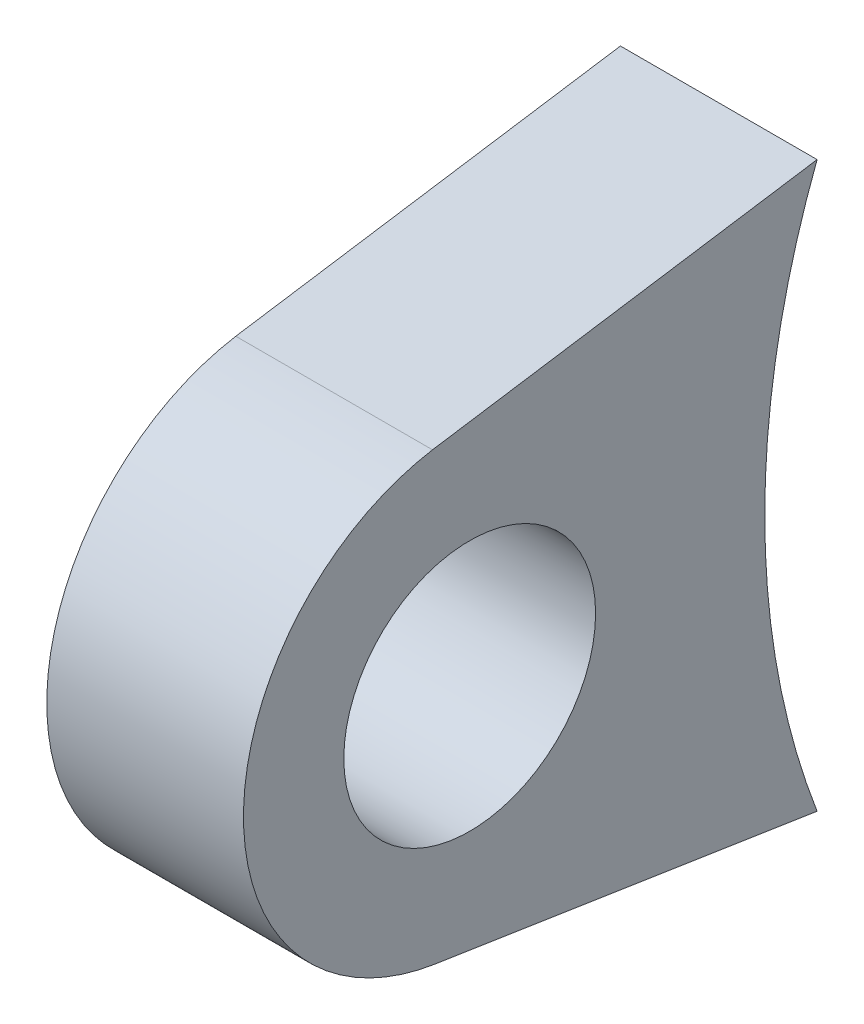
ISO-10303-21;
HEADER;
FILE_DESCRIPTION(('STEP AP214'),'2;1');
FILE_NAME('part.step','',(''),(''),'','','');
FILE_SCHEMA(('AUTOMOTIVE_DESIGN { 1 0 10303 214 1 1 1 1 }'));
ENDSEC;
DATA;
#1=APPLICATION_CONTEXT('core data for automotive mechanical design processes');
#2=APPLICATION_PROTOCOL_DEFINITION('international standard','automotive_design',2000,#1);
#3=PRODUCT_CONTEXT('',#1,'mechanical');
#4=PRODUCT('Part','Part','',(#3));
#5=PRODUCT_RELATED_PRODUCT_CATEGORY('part','',(#4));
#6=PRODUCT_DEFINITION_FORMATION('','',#4);
#7=PRODUCT_DEFINITION_CONTEXT('part definition',#1,'design');
#8=PRODUCT_DEFINITION('design','',#6,#7);
#9=PRODUCT_DEFINITION_SHAPE('','',#8);
#10=(LENGTH_UNIT() NAMED_UNIT(*) SI_UNIT(.MILLI.,.METRE.));
#11=(NAMED_UNIT(*) PLANE_ANGLE_UNIT() SI_UNIT($,.RADIAN.));
#12=(NAMED_UNIT(*) SI_UNIT($,.STERADIAN.) SOLID_ANGLE_UNIT());
#13=UNCERTAINTY_MEASURE_WITH_UNIT(LENGTH_MEASURE(1.E-05),#10,'distance_accuracy_value','');
#14=(GEOMETRIC_REPRESENTATION_CONTEXT(3) GLOBAL_UNCERTAINTY_ASSIGNED_CONTEXT((#13)) GLOBAL_UNIT_ASSIGNED_CONTEXT((#10,
#11,#12)) REPRESENTATION_CONTEXT('',''));
#15=CARTESIAN_POINT('',(0.,0.,0.));
#16=DIRECTION('',(0.,0.,1.));
#17=DIRECTION('',(1.,0.,0.));
#18=AXIS2_PLACEMENT_3D('',#15,#16,#17);
#19=CARTESIAN_POINT('',(86.7854475036722,9.80766511746572,1.50572599900162));
#20=DIRECTION('',(0.,-0.988419292284904,-0.15174749631875));
#21=DIRECTION('',(0.,0.15174749631875,-0.988419292284904));
#22=AXIS2_PLACEMENT_3D('',#19,#20,#21);
#23=PLANE('',#22);
#24=DIRECTION('',(0.,0.15174749631875,-0.988419292284904));
#25=VECTOR('',#24,1.);
#26=CARTESIAN_POINT('',(91.7854475036721,9.80766511746572,1.50572599900162));
#27=LINE('',#26,#25);
#28=CARTESIAN_POINT('',(91.7854475036721,5.67165495404934,28.4459545878146));
#29=VERTEX_POINT('',#28);
#30=CARTESIAN_POINT('',(91.7854475036721,7.17257303718955,18.6696062097244));
#31=VERTEX_POINT('',#30);
#32=EDGE_CURVE('E107',#29,#31,#27,.T.);
#33=ORIENTED_EDGE('',*,*,#32,.T.);
#34=DIRECTION('',(1.,0.,0.));
#35=VECTOR('',#34,1.);
#36=CARTESIAN_POINT('',(86.7854475036722,7.17257303718955,18.6696062097244));
#37=LINE('',#36,#35);
#38=CARTESIAN_POINT('',(86.7854475036722,7.17257303718955,18.6696062097244));
#39=VERTEX_POINT('',#38);
#40=EDGE_CURVE('E11',#39,#31,#37,.T.);
#41=ORIENTED_EDGE('',*,*,#40,.F.);
#42=DIRECTION('',(0.,0.15174749631875,-0.988419292284904));
#43=VECTOR('',#42,1.);
#44=CARTESIAN_POINT('',(86.7854475036722,9.80766511746572,1.50572599900162));
#45=LINE('',#44,#43);
#46=CARTESIAN_POINT('',(86.7854475036722,5.67165495404934,28.4459545878146));
#47=VERTEX_POINT('',#46);
#48=EDGE_CURVE('E98',#47,#39,#45,.T.);
#49=ORIENTED_EDGE('',*,*,#48,.F.);
#50=DIRECTION('',(1.,0.,0.));
#51=VECTOR('',#50,1.);
#52=CARTESIAN_POINT('',(86.7854475036722,5.67165495404934,28.4459545878146));
#53=LINE('',#52,#51);
#54=EDGE_CURVE('E41',#47,#29,#53,.T.);
#55=ORIENTED_EDGE('',*,*,#54,.T.);
#56=EDGE_LOOP('',(#33,#41,#49,#55));
#57=FACE_BOUND('',#56,.T.);
#58=ADVANCED_FACE('F38',(#57),#23,.F.);
#59=CARTESIAN_POINT('',(86.7854475036722,0.,0.));
#60=DIRECTION('',(1.,0.,0.));
#61=DIRECTION('',(0.,0.,-1.));
#62=AXIS2_PLACEMENT_3D('',#59,#60,#61);
#63=CYLINDRICAL_SURFACE('',#62,20.);
#64=CARTESIAN_POINT('',(91.7854475036721,0.,0.));
#65=DIRECTION('',(1.,0.,0.));
#66=DIRECTION('',(0.,0.,-1.));
#67=AXIS2_PLACEMENT_3D('',#64,#65,#66);
#68=CIRCLE('',#67,20.);
#69=CARTESIAN_POINT('',(91.7854475036721,-7.17257303718955,18.6696062097244));
#70=VERTEX_POINT('',#69);
#71=EDGE_CURVE('E69',#31,#70,#68,.T.);
#72=ORIENTED_EDGE('',*,*,#71,.T.);
#73=DIRECTION('',(1.,0.,0.));
#74=VECTOR('',#73,1.);
#75=CARTESIAN_POINT('',(86.7854475036722,-7.17257303718955,18.6696062097244));
#76=LINE('',#75,#74);
#77=CARTESIAN_POINT('',(86.7854475036722,-7.17257303718955,18.6696062097244));
#78=VERTEX_POINT('',#77);
#79=EDGE_CURVE('E47',#78,#70,#76,.T.);
#80=ORIENTED_EDGE('',*,*,#79,.F.);
#81=CARTESIAN_POINT('',(86.7854475036722,0.,0.));
#82=DIRECTION('',(1.,0.,0.));
#83=DIRECTION('',(0.,0.,-1.));
#84=AXIS2_PLACEMENT_3D('',#81,#82,#83);
#85=CIRCLE('',#84,20.);
#86=EDGE_CURVE('E55',#39,#78,#85,.T.);
#87=ORIENTED_EDGE('',*,*,#86,.F.);
#88=ORIENTED_EDGE('',*,*,#40,.T.);
#89=EDGE_LOOP('',(#72,#80,#87,#88));
#90=FACE_BOUND('',#89,.T.);
#91=ADVANCED_FACE('F120',(#90),#63,.F.);
#92=CARTESIAN_POINT('',(86.7854475036722,-9.80689850839444,1.50511687408894));
#93=DIRECTION('',(0.,0.988426720231568,-0.151699105904634));
#94=DIRECTION('',(0.,0.151699105904634,0.988426720231568));
#95=AXIS2_PLACEMENT_3D('',#92,#93,#94);
#96=PLANE('',#95);
#97=DIRECTION('',(0.,0.151699105904634,0.988426720231568));
#98=VECTOR('',#97,1.);
#99=CARTESIAN_POINT('',(91.7854475036721,-9.80689850839444,1.50511687408894));
#100=LINE('',#99,#98);
#101=CARTESIAN_POINT('',(91.7854475036721,-5.68345364133152,28.3722698589516));
#102=VERTEX_POINT('',#101);
#103=EDGE_CURVE('E95',#70,#102,#100,.T.);
#104=ORIENTED_EDGE('',*,*,#103,.T.);
#105=DIRECTION('',(1.,0.,0.));
#106=VECTOR('',#105,1.);
#107=CARTESIAN_POINT('',(86.7854475036722,-5.68345364133152,28.3722698589516));
#108=LINE('',#107,#106);
#109=CARTESIAN_POINT('',(86.7854475036722,-5.68345364133152,28.3722698589516));
#110=VERTEX_POINT('',#109);
#111=EDGE_CURVE('E93',#110,#102,#108,.T.);
#112=ORIENTED_EDGE('',*,*,#111,.F.);
#113=DIRECTION('',(0.,0.151699105904634,0.988426720231568));
#114=VECTOR('',#113,1.);
#115=CARTESIAN_POINT('',(86.7854475036722,-9.80689850839444,1.50511687408894));
#116=LINE('',#115,#114);
#117=EDGE_CURVE('E85',#78,#110,#116,.T.);
#118=ORIENTED_EDGE('',*,*,#117,.F.);
#119=ORIENTED_EDGE('',*,*,#79,.T.);
#120=EDGE_LOOP('',(#104,#112,#118,#119));
#121=FACE_BOUND('',#120,.T.);
#122=ADVANCED_FACE('F94',(#121),#96,.F.);
#123=CARTESIAN_POINT('',(86.7854475036722,0.,27.5));
#124=DIRECTION('',(1.,0.,0.));
#125=DIRECTION('',(0.,0.,-1.));
#126=AXIS2_PLACEMENT_3D('',#123,#124,#125);
#127=CYLINDRICAL_SURFACE('',#126,5.75);
#128=CARTESIAN_POINT('',(91.7854475036721,0.,27.5));
#129=DIRECTION('',(1.,0.,0.));
#130=DIRECTION('',(0.,0.,-1.));
#131=AXIS2_PLACEMENT_3D('',#128,#129,#130);
#132=CIRCLE('',#131,5.75);
#133=EDGE_CURVE('E110',#29,#102,#132,.T.);
#134=ORIENTED_EDGE('',*,*,#133,.F.);
#135=ORIENTED_EDGE('',*,*,#54,.F.);
#136=CARTESIAN_POINT('',(86.7854475036722,0.,27.5));
#137=DIRECTION('',(1.,0.,0.));
#138=DIRECTION('',(0.,0.,-1.));
#139=AXIS2_PLACEMENT_3D('',#136,#137,#138);
#140=CIRCLE('',#139,5.75);
#141=EDGE_CURVE('E89',#47,#110,#140,.T.);
#142=ORIENTED_EDGE('',*,*,#141,.T.);
#143=ORIENTED_EDGE('',*,*,#111,.T.);
#144=EDGE_LOOP('',(#134,#135,#142,#143));
#145=FACE_BOUND('',#144,.T.);
#146=ADVANCED_FACE('F97',(#145),#127,.T.);
#147=CARTESIAN_POINT('',(86.7854475036722,0.,27.5));
#148=DIRECTION('',(1.,0.,0.));
#149=DIRECTION('',(0.,0.,-1.));
#150=AXIS2_PLACEMENT_3D('',#147,#148,#149);
#151=CYLINDRICAL_SURFACE('',#150,3.2);
#152=CARTESIAN_POINT('',(86.7854475036722,0.,27.5));
#153=DIRECTION('',(1.,0.,0.));
#154=DIRECTION('',(0.,0.,-1.));
#155=AXIS2_PLACEMENT_3D('',#152,#153,#154);
#156=CIRCLE('',#155,3.2);
#157=CARTESIAN_POINT('',(86.7854475036722,0.,24.3));
#158=VERTEX_POINT('',#157);
#159=EDGE_CURVE('E104',#158,#158,#156,.T.);
#160=ORIENTED_EDGE('',*,*,#159,.F.);
#161=EDGE_LOOP('',(#160));
#162=FACE_BOUND('',#161,.T.);
#163=CARTESIAN_POINT('',(91.7854475036721,0.,27.5));
#164=DIRECTION('',(1.,0.,0.));
#165=DIRECTION('',(0.,0.,-1.));
#166=AXIS2_PLACEMENT_3D('',#163,#164,#165);
#167=CIRCLE('',#166,3.2);
#168=CARTESIAN_POINT('',(91.7854475036721,0.,24.3));
#169=VERTEX_POINT('',#168);
#170=EDGE_CURVE('E100',#169,#169,#167,.T.);
#171=ORIENTED_EDGE('',*,*,#170,.T.);
#172=EDGE_LOOP('',(#171));
#173=FACE_BOUND('',#172,.T.);
#174=ADVANCED_FACE('F129',(#162,#173),#151,.F.);
#175=CARTESIAN_POINT('',(86.7854475036722,0.,0.));
#176=DIRECTION('',(1.,0.,0.));
#177=DIRECTION('',(0.,0.,-1.));
#178=AXIS2_PLACEMENT_3D('',#175,#176,#177);
#179=PLANE('',#178);
#180=ORIENTED_EDGE('',*,*,#48,.T.);
#181=ORIENTED_EDGE('',*,*,#86,.T.);
#182=ORIENTED_EDGE('',*,*,#117,.T.);
#183=ORIENTED_EDGE('',*,*,#141,.F.);
#184=EDGE_LOOP('',(#180,#181,#182,#183));
#185=FACE_BOUND('',#184,.T.);
#186=ORIENTED_EDGE('',*,*,#159,.T.);
#187=EDGE_LOOP('',(#186));
#188=FACE_BOUND('',#187,.T.);
#189=ADVANCED_FACE('F87',(#185,#188),#179,.F.);
#190=CARTESIAN_POINT('',(91.7854475036721,0.,0.));
#191=DIRECTION('',(1.,0.,0.));
#192=DIRECTION('',(0.,0.,-1.));
#193=AXIS2_PLACEMENT_3D('',#190,#191,#192);
#194=PLANE('',#193);
#195=ORIENTED_EDGE('',*,*,#32,.F.);
#196=ORIENTED_EDGE('',*,*,#133,.T.);
#197=ORIENTED_EDGE('',*,*,#103,.F.);
#198=ORIENTED_EDGE('',*,*,#71,.F.);
#199=EDGE_LOOP('',(#195,#196,#197,#198));
#200=FACE_BOUND('',#199,.T.);
#201=ORIENTED_EDGE('',*,*,#170,.F.);
#202=EDGE_LOOP('',(#201));
#203=FACE_BOUND('',#202,.T.);
#204=ADVANCED_FACE('F116',(#200,#203),#194,.T.);
#205=CLOSED_SHELL('',(#58,#91,#122,#146,#174,#189,#204));
#206=MANIFOLD_SOLID_BREP('B2',#205);
#207=ADVANCED_BREP_SHAPE_REPRESENTATION('',(#18,#206),#14);
#208=SHAPE_DEFINITION_REPRESENTATION(#9,#207);
ENDSEC;
END-ISO-10303-21;
